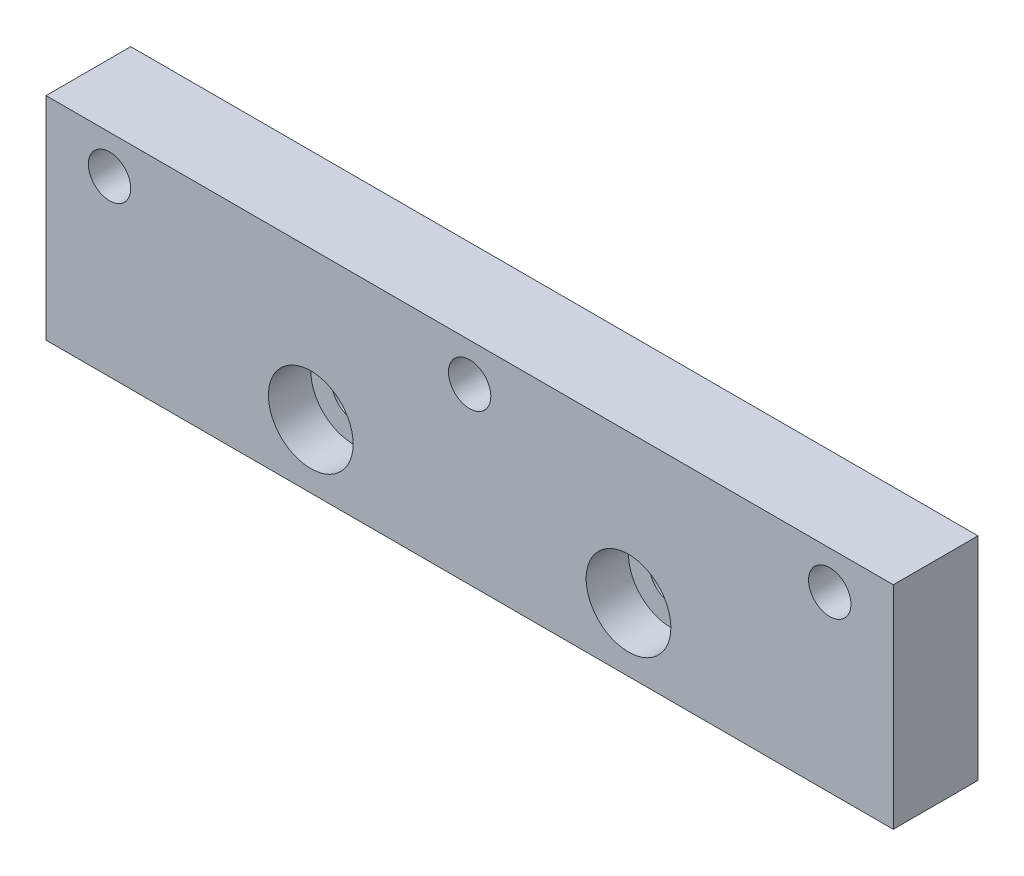
ISO-10303-21;
HEADER;
FILE_DESCRIPTION(('STEP AP214'),'2;1');
FILE_NAME('part.step','',(''),(''),'','','');
FILE_SCHEMA(('AUTOMOTIVE_DESIGN { 1 0 10303 214 1 1 1 1 }'));
ENDSEC;
DATA;
#1=APPLICATION_CONTEXT('core data for automotive mechanical design processes');
#2=APPLICATION_PROTOCOL_DEFINITION('international standard','automotive_design',2000,#1);
#3=PRODUCT_CONTEXT('',#1,'mechanical');
#4=PRODUCT('Part','Part','',(#3));
#5=PRODUCT_RELATED_PRODUCT_CATEGORY('part','',(#4));
#6=PRODUCT_DEFINITION_FORMATION('','',#4);
#7=PRODUCT_DEFINITION_CONTEXT('part definition',#1,'design');
#8=PRODUCT_DEFINITION('design','',#6,#7);
#9=PRODUCT_DEFINITION_SHAPE('','',#8);
#10=(LENGTH_UNIT() NAMED_UNIT(*) SI_UNIT(.MILLI.,.METRE.));
#11=(NAMED_UNIT(*) PLANE_ANGLE_UNIT() SI_UNIT($,.RADIAN.));
#12=(NAMED_UNIT(*) SI_UNIT($,.STERADIAN.) SOLID_ANGLE_UNIT());
#13=UNCERTAINTY_MEASURE_WITH_UNIT(LENGTH_MEASURE(1.E-05),#10,'distance_accuracy_value','');
#14=(GEOMETRIC_REPRESENTATION_CONTEXT(3) GLOBAL_UNCERTAINTY_ASSIGNED_CONTEXT((#13)) GLOBAL_UNIT_ASSIGNED_CONTEXT((#10,
#11,#12)) REPRESENTATION_CONTEXT('',''));
#15=CARTESIAN_POINT('',(0.,0.,0.));
#16=DIRECTION('',(0.,0.,1.));
#17=DIRECTION('',(1.,0.,0.));
#18=AXIS2_PLACEMENT_3D('',#15,#16,#17);
#19=CARTESIAN_POINT('',(-7.5,-2.,0.));
#20=DIRECTION('',(0.,0.,1.));
#21=DIRECTION('',(1.,0.,0.));
#22=AXIS2_PLACEMENT_3D('',#19,#20,#21);
#23=CYLINDRICAL_SURFACE('',#22,1.);
#24=CARTESIAN_POINT('',(-7.5,-2.,0.));
#25=DIRECTION('',(0.,0.,1.));
#26=DIRECTION('',(1.,0.,0.));
#27=AXIS2_PLACEMENT_3D('',#24,#25,#26);
#28=CIRCLE('',#27,1.);
#29=CARTESIAN_POINT('',(-6.5,-2.,0.));
#30=VERTEX_POINT('',#29);
#31=EDGE_CURVE('E119',#30,#30,#28,.T.);
#32=ORIENTED_EDGE('',*,*,#31,.F.);
#33=EDGE_LOOP('',(#32));
#34=FACE_BOUND('',#33,.T.);
#35=CARTESIAN_POINT('',(-7.5,-2.,2.));
#36=DIRECTION('',(0.,0.,1.));
#37=DIRECTION('',(1.,0.,0.));
#38=AXIS2_PLACEMENT_3D('',#35,#36,#37);
#39=CIRCLE('',#38,1.);
#40=CARTESIAN_POINT('',(-6.5,-2.,2.));
#41=VERTEX_POINT('',#40);
#42=EDGE_CURVE('E42',#41,#41,#39,.F.);
#43=ORIENTED_EDGE('',*,*,#42,.F.);
#44=EDGE_LOOP('',(#43));
#45=FACE_BOUND('',#44,.T.);
#46=ADVANCED_FACE('F38',(#34,#45),#23,.F.);
#47=CARTESIAN_POINT('',(7.5,-2.,0.));
#48=DIRECTION('',(0.,0.,1.));
#49=DIRECTION('',(1.,0.,0.));
#50=AXIS2_PLACEMENT_3D('',#47,#48,#49);
#51=CYLINDRICAL_SURFACE('',#50,1.);
#52=CARTESIAN_POINT('',(7.5,-2.,0.));
#53=DIRECTION('',(0.,0.,1.));
#54=DIRECTION('',(1.,0.,0.));
#55=AXIS2_PLACEMENT_3D('',#52,#53,#54);
#56=CIRCLE('',#55,1.);
#57=CARTESIAN_POINT('',(8.5,-2.,0.));
#58=VERTEX_POINT('',#57);
#59=EDGE_CURVE('E151',#58,#58,#56,.T.);
#60=ORIENTED_EDGE('',*,*,#59,.F.);
#61=EDGE_LOOP('',(#60));
#62=FACE_BOUND('',#61,.T.);
#63=CARTESIAN_POINT('',(7.5,-2.,2.));
#64=DIRECTION('',(0.,0.,1.));
#65=DIRECTION('',(1.,0.,0.));
#66=AXIS2_PLACEMENT_3D('',#63,#64,#65);
#67=CIRCLE('',#66,1.);
#68=CARTESIAN_POINT('',(8.5,-2.,2.));
#69=VERTEX_POINT('',#68);
#70=EDGE_CURVE('E113',#69,#69,#67,.F.);
#71=ORIENTED_EDGE('',*,*,#70,.F.);
#72=EDGE_LOOP('',(#71));
#73=FACE_BOUND('',#72,.T.);
#74=ADVANCED_FACE('F162',(#62,#73),#51,.F.);
#75=CARTESIAN_POINT('',(20.,5.,4.));
#76=DIRECTION('',(-1.,0.,0.));
#77=DIRECTION('',(0.,0.,1.));
#78=AXIS2_PLACEMENT_3D('',#75,#76,#77);
#79=PLANE('',#78);
#80=DIRECTION('',(0.,1.,0.));
#81=VECTOR('',#80,1.);
#82=CARTESIAN_POINT('',(20.,5.,0.));
#83=LINE('',#82,#81);
#84=CARTESIAN_POINT('',(20.,-5.,0.));
#85=VERTEX_POINT('',#84);
#86=CARTESIAN_POINT('',(20.,5.,0.));
#87=VERTEX_POINT('',#86);
#88=EDGE_CURVE('E105',#85,#87,#83,.T.);
#89=ORIENTED_EDGE('',*,*,#88,.T.);
#90=DIRECTION('',(0.,0.,-1.));
#91=VECTOR('',#90,1.);
#92=CARTESIAN_POINT('',(20.,5.,4.));
#93=LINE('',#92,#91);
#94=CARTESIAN_POINT('',(20.,5.,4.));
#95=VERTEX_POINT('',#94);
#96=EDGE_CURVE('E11',#95,#87,#93,.T.);
#97=ORIENTED_EDGE('',*,*,#96,.F.);
#98=DIRECTION('',(0.,1.,0.));
#99=VECTOR('',#98,1.);
#100=CARTESIAN_POINT('',(20.,5.,4.));
#101=LINE('',#100,#99);
#102=CARTESIAN_POINT('',(20.,-5.,4.));
#103=VERTEX_POINT('',#102);
#104=EDGE_CURVE('E92',#103,#95,#101,.T.);
#105=ORIENTED_EDGE('',*,*,#104,.F.);
#106=DIRECTION('',(0.,0.,-1.));
#107=VECTOR('',#106,1.);
#108=CARTESIAN_POINT('',(20.,-5.,4.));
#109=LINE('',#108,#107);
#110=EDGE_CURVE('E101',#103,#85,#109,.T.);
#111=ORIENTED_EDGE('',*,*,#110,.T.);
#112=EDGE_LOOP('',(#89,#97,#105,#111));
#113=FACE_BOUND('',#112,.T.);
#114=ADVANCED_FACE('F40',(#113),#79,.F.);
#115=CARTESIAN_POINT('',(-20.,5.,4.));
#116=DIRECTION('',(0.,-1.,0.));
#117=DIRECTION('',(0.,0.,-1.));
#118=AXIS2_PLACEMENT_3D('',#115,#116,#117);
#119=PLANE('',#118);
#120=DIRECTION('',(-1.,0.,0.));
#121=VECTOR('',#120,1.);
#122=CARTESIAN_POINT('',(-20.,5.,0.));
#123=LINE('',#122,#121);
#124=CARTESIAN_POINT('',(-20.,5.,0.));
#125=VERTEX_POINT('',#124);
#126=EDGE_CURVE('E96',#87,#125,#123,.T.);
#127=ORIENTED_EDGE('',*,*,#126,.T.);
#128=DIRECTION('',(0.,0.,-1.));
#129=VECTOR('',#128,1.);
#130=CARTESIAN_POINT('',(-20.,5.,4.));
#131=LINE('',#130,#129);
#132=CARTESIAN_POINT('',(-20.,5.,4.));
#133=VERTEX_POINT('',#132);
#134=EDGE_CURVE('E48',#133,#125,#131,.T.);
#135=ORIENTED_EDGE('',*,*,#134,.F.);
#136=DIRECTION('',(-1.,0.,0.));
#137=VECTOR('',#136,1.);
#138=CARTESIAN_POINT('',(-20.,5.,4.));
#139=LINE('',#138,#137);
#140=EDGE_CURVE('E87',#95,#133,#139,.T.);
#141=ORIENTED_EDGE('',*,*,#140,.F.);
#142=ORIENTED_EDGE('',*,*,#96,.T.);
#143=EDGE_LOOP('',(#127,#135,#141,#142));
#144=FACE_BOUND('',#143,.T.);
#145=ADVANCED_FACE('F95',(#144),#119,.F.);
#146=CARTESIAN_POINT('',(-20.,5.,4.));
#147=DIRECTION('',(1.,0.,0.));
#148=DIRECTION('',(0.,0.,-1.));
#149=AXIS2_PLACEMENT_3D('',#146,#147,#148);
#150=PLANE('',#149);
#151=DIRECTION('',(0.,-1.,0.));
#152=VECTOR('',#151,1.);
#153=CARTESIAN_POINT('',(-20.,5.,0.));
#154=LINE('',#153,#152);
#155=CARTESIAN_POINT('',(-20.,-5.,0.));
#156=VERTEX_POINT('',#155);
#157=EDGE_CURVE('E74',#125,#156,#154,.T.);
#158=ORIENTED_EDGE('',*,*,#157,.T.);
#159=DIRECTION('',(0.,0.,-1.));
#160=VECTOR('',#159,1.);
#161=CARTESIAN_POINT('',(-20.,-5.,4.));
#162=LINE('',#161,#160);
#163=CARTESIAN_POINT('',(-20.,-5.,4.));
#164=VERTEX_POINT('',#163);
#165=EDGE_CURVE('E97',#164,#156,#162,.T.);
#166=ORIENTED_EDGE('',*,*,#165,.F.);
#167=DIRECTION('',(0.,-1.,0.));
#168=VECTOR('',#167,1.);
#169=CARTESIAN_POINT('',(-20.,5.,4.));
#170=LINE('',#169,#168);
#171=EDGE_CURVE('E90',#133,#164,#170,.T.);
#172=ORIENTED_EDGE('',*,*,#171,.F.);
#173=ORIENTED_EDGE('',*,*,#134,.T.);
#174=EDGE_LOOP('',(#158,#166,#172,#173));
#175=FACE_BOUND('',#174,.T.);
#176=ADVANCED_FACE('F99',(#175),#150,.F.);
#177=CARTESIAN_POINT('',(-20.,-5.,4.));
#178=DIRECTION('',(0.,1.,0.));
#179=DIRECTION('',(0.,0.,1.));
#180=AXIS2_PLACEMENT_3D('',#177,#178,#179);
#181=PLANE('',#180);
#182=DIRECTION('',(1.,0.,0.));
#183=VECTOR('',#182,1.);
#184=CARTESIAN_POINT('',(-20.,-5.,0.));
#185=LINE('',#184,#183);
#186=EDGE_CURVE('E80',#156,#85,#185,.T.);
#187=ORIENTED_EDGE('',*,*,#186,.T.);
#188=ORIENTED_EDGE('',*,*,#110,.F.);
#189=DIRECTION('',(1.,0.,0.));
#190=VECTOR('',#189,1.);
#191=CARTESIAN_POINT('',(-20.,-5.,4.));
#192=LINE('',#191,#190);
#193=EDGE_CURVE('E57',#164,#103,#192,.T.);
#194=ORIENTED_EDGE('',*,*,#193,.F.);
#195=ORIENTED_EDGE('',*,*,#165,.T.);
#196=EDGE_LOOP('',(#187,#188,#194,#195));
#197=FACE_BOUND('',#196,.T.);
#198=ADVANCED_FACE('F201',(#197),#181,.F.);
#199=CARTESIAN_POINT('',(0.,0.,4.));
#200=DIRECTION('',(0.,0.,1.));
#201=DIRECTION('',(1.,0.,0.));
#202=AXIS2_PLACEMENT_3D('',#199,#200,#201);
#203=PLANE('',#202);
#204=CARTESIAN_POINT('',(-7.5,-2.,4.));
#205=DIRECTION('',(0.,0.,1.));
#206=DIRECTION('',(1.,0.,0.));
#207=AXIS2_PLACEMENT_3D('',#204,#205,#206);
#208=CIRCLE('',#207,2.);
#209=CARTESIAN_POINT('',(-5.5,-2.,4.));
#210=VERTEX_POINT('',#209);
#211=EDGE_CURVE('E121',#210,#210,#208,.T.);
#212=ORIENTED_EDGE('',*,*,#211,.F.);
#213=EDGE_LOOP('',(#212));
#214=FACE_BOUND('',#213,.T.);
#215=CARTESIAN_POINT('',(7.5,-2.,4.));
#216=DIRECTION('',(0.,0.,1.));
#217=DIRECTION('',(1.,0.,0.));
#218=AXIS2_PLACEMENT_3D('',#215,#216,#217);
#219=CIRCLE('',#218,2.);
#220=CARTESIAN_POINT('',(9.5,-2.,4.));
#221=VERTEX_POINT('',#220);
#222=EDGE_CURVE('E126',#221,#221,#219,.T.);
#223=ORIENTED_EDGE('',*,*,#222,.F.);
#224=EDGE_LOOP('',(#223));
#225=FACE_BOUND('',#224,.T.);
#226=CARTESIAN_POINT('',(-16.9999999999991,3.20000000000005,4.));
#227=DIRECTION('',(0.,0.,1.));
#228=DIRECTION('',(1.,0.,0.));
#229=AXIS2_PLACEMENT_3D('',#226,#227,#228);
#230=CIRCLE('',#229,1.);
#231=CARTESIAN_POINT('',(-15.9999999999991,3.20000000000005,4.));
#232=VERTEX_POINT('',#231);
#233=EDGE_CURVE('E136',#232,#232,#230,.T.);
#234=ORIENTED_EDGE('',*,*,#233,.F.);
#235=EDGE_LOOP('',(#234));
#236=FACE_BOUND('',#235,.T.);
#237=CARTESIAN_POINT('',(8.98586760555986E-13,3.20000000000005,4.));
#238=DIRECTION('',(0.,0.,1.));
#239=DIRECTION('',(1.,0.,0.));
#240=AXIS2_PLACEMENT_3D('',#237,#238,#239);
#241=CIRCLE('',#240,1.);
#242=CARTESIAN_POINT('',(1.0000000000009,3.20000000000005,4.));
#243=VERTEX_POINT('',#242);
#244=EDGE_CURVE('E139',#243,#243,#241,.T.);
#245=ORIENTED_EDGE('',*,*,#244,.F.);
#246=EDGE_LOOP('',(#245));
#247=FACE_BOUND('',#246,.T.);
#248=CARTESIAN_POINT('',(17.0000000000009,3.20000000000005,4.));
#249=DIRECTION('',(0.,0.,1.));
#250=DIRECTION('',(1.,0.,0.));
#251=AXIS2_PLACEMENT_3D('',#248,#249,#250);
#252=CIRCLE('',#251,1.);
#253=CARTESIAN_POINT('',(18.0000000000009,3.20000000000005,4.));
#254=VERTEX_POINT('',#253);
#255=EDGE_CURVE('E145',#254,#254,#252,.T.);
#256=ORIENTED_EDGE('',*,*,#255,.F.);
#257=EDGE_LOOP('',(#256));
#258=FACE_BOUND('',#257,.T.);
#259=ORIENTED_EDGE('',*,*,#104,.T.);
#260=ORIENTED_EDGE('',*,*,#140,.T.);
#261=ORIENTED_EDGE('',*,*,#171,.T.);
#262=ORIENTED_EDGE('',*,*,#193,.T.);
#263=EDGE_LOOP('',(#259,#260,#261,#262));
#264=FACE_BOUND('',#263,.T.);
#265=ADVANCED_FACE('F88',(#214,#225,#236,#247,#258,#264),#203,.T.);
#266=CARTESIAN_POINT('',(0.,0.,0.));
#267=DIRECTION('',(0.,0.,1.));
#268=DIRECTION('',(1.,0.,0.));
#269=AXIS2_PLACEMENT_3D('',#266,#267,#268);
#270=PLANE('',#269);
#271=CARTESIAN_POINT('',(-16.9999999999991,3.20000000000005,0.));
#272=DIRECTION('',(0.,0.,1.));
#273=DIRECTION('',(1.,0.,0.));
#274=AXIS2_PLACEMENT_3D('',#271,#272,#273);
#275=CIRCLE('',#274,1.);
#276=CARTESIAN_POINT('',(-15.9999999999991,3.20000000000005,0.));
#277=VERTEX_POINT('',#276);
#278=EDGE_CURVE('E108',#277,#277,#275,.T.);
#279=ORIENTED_EDGE('',*,*,#278,.T.);
#280=EDGE_LOOP('',(#279));
#281=FACE_BOUND('',#280,.T.);
#282=CARTESIAN_POINT('',(8.98586760555986E-13,3.20000000000005,0.));
#283=DIRECTION('',(0.,0.,1.));
#284=DIRECTION('',(1.,0.,0.));
#285=AXIS2_PLACEMENT_3D('',#282,#283,#284);
#286=CIRCLE('',#285,1.);
#287=CARTESIAN_POINT('',(1.0000000000009,3.20000000000005,0.));
#288=VERTEX_POINT('',#287);
#289=EDGE_CURVE('E142',#288,#288,#286,.T.);
#290=ORIENTED_EDGE('',*,*,#289,.T.);
#291=EDGE_LOOP('',(#290));
#292=FACE_BOUND('',#291,.T.);
#293=CARTESIAN_POINT('',(17.0000000000009,3.20000000000005,0.));
#294=DIRECTION('',(0.,0.,1.));
#295=DIRECTION('',(1.,0.,0.));
#296=AXIS2_PLACEMENT_3D('',#293,#294,#295);
#297=CIRCLE('',#296,1.);
#298=CARTESIAN_POINT('',(18.0000000000009,3.20000000000005,0.));
#299=VERTEX_POINT('',#298);
#300=EDGE_CURVE('E148',#299,#299,#297,.T.);
#301=ORIENTED_EDGE('',*,*,#300,.T.);
#302=EDGE_LOOP('',(#301));
#303=FACE_BOUND('',#302,.T.);
#304=ORIENTED_EDGE('',*,*,#59,.T.);
#305=EDGE_LOOP('',(#304));
#306=FACE_BOUND('',#305,.T.);
#307=ORIENTED_EDGE('',*,*,#31,.T.);
#308=EDGE_LOOP('',(#307));
#309=FACE_BOUND('',#308,.T.);
#310=ORIENTED_EDGE('',*,*,#88,.F.);
#311=ORIENTED_EDGE('',*,*,#186,.F.);
#312=ORIENTED_EDGE('',*,*,#157,.F.);
#313=ORIENTED_EDGE('',*,*,#126,.F.);
#314=EDGE_LOOP('',(#310,#311,#312,#313));
#315=FACE_BOUND('',#314,.T.);
#316=ADVANCED_FACE('F157',(#281,#292,#303,#306,#309,#315),#270,.F.);
#317=CARTESIAN_POINT('',(17.0000000000009,3.20000000000005,0.));
#318=DIRECTION('',(0.,0.,1.));
#319=DIRECTION('',(1.,0.,0.));
#320=AXIS2_PLACEMENT_3D('',#317,#318,#319);
#321=CYLINDRICAL_SURFACE('',#320,1.);
#322=ORIENTED_EDGE('',*,*,#300,.F.);
#323=EDGE_LOOP('',(#322));
#324=FACE_BOUND('',#323,.T.);
#325=ORIENTED_EDGE('',*,*,#255,.T.);
#326=EDGE_LOOP('',(#325));
#327=FACE_BOUND('',#326,.T.);
#328=ADVANCED_FACE('F191',(#324,#327),#321,.F.);
#329=CARTESIAN_POINT('',(8.98586760555986E-13,3.20000000000005,0.));
#330=DIRECTION('',(0.,0.,1.));
#331=DIRECTION('',(1.,0.,0.));
#332=AXIS2_PLACEMENT_3D('',#329,#330,#331);
#333=CYLINDRICAL_SURFACE('',#332,1.);
#334=ORIENTED_EDGE('',*,*,#289,.F.);
#335=EDGE_LOOP('',(#334));
#336=FACE_BOUND('',#335,.T.);
#337=ORIENTED_EDGE('',*,*,#244,.T.);
#338=EDGE_LOOP('',(#337));
#339=FACE_BOUND('',#338,.T.);
#340=ADVANCED_FACE('F187',(#336,#339),#333,.F.);
#341=CARTESIAN_POINT('',(-16.9999999999991,3.20000000000005,0.));
#342=DIRECTION('',(0.,0.,1.));
#343=DIRECTION('',(1.,0.,0.));
#344=AXIS2_PLACEMENT_3D('',#341,#342,#343);
#345=CYLINDRICAL_SURFACE('',#344,1.);
#346=ORIENTED_EDGE('',*,*,#278,.F.);
#347=EDGE_LOOP('',(#346));
#348=FACE_BOUND('',#347,.T.);
#349=ORIENTED_EDGE('',*,*,#233,.T.);
#350=EDGE_LOOP('',(#349));
#351=FACE_BOUND('',#350,.T.);
#352=ADVANCED_FACE('F183',(#348,#351),#345,.F.);
#353=CARTESIAN_POINT('',(7.5,-2.,2.));
#354=DIRECTION('',(0.,0.,1.));
#355=DIRECTION('',(1.,0.,0.));
#356=AXIS2_PLACEMENT_3D('',#353,#354,#355);
#357=PLANE('',#356);
#358=CARTESIAN_POINT('',(7.5,-2.,2.));
#359=DIRECTION('',(0.,0.,1.));
#360=DIRECTION('',(1.,0.,0.));
#361=AXIS2_PLACEMENT_3D('',#358,#359,#360);
#362=CIRCLE('',#361,2.);
#363=CARTESIAN_POINT('',(9.5,-2.,2.));
#364=VERTEX_POINT('',#363);
#365=EDGE_CURVE('E131',#364,#364,#362,.T.);
#366=ORIENTED_EDGE('',*,*,#365,.T.);
#367=EDGE_LOOP('',(#366));
#368=FACE_BOUND('',#367,.T.);
#369=ORIENTED_EDGE('',*,*,#70,.T.);
#370=EDGE_LOOP('',(#369));
#371=FACE_BOUND('',#370,.T.);
#372=ADVANCED_FACE('F177',(#368,#371),#357,.T.);
#373=CARTESIAN_POINT('',(7.5,-2.,2.));
#374=DIRECTION('',(0.,0.,1.));
#375=DIRECTION('',(1.,0.,0.));
#376=AXIS2_PLACEMENT_3D('',#373,#374,#375);
#377=CYLINDRICAL_SURFACE('',#376,2.);
#378=ORIENTED_EDGE('',*,*,#365,.F.);
#379=EDGE_LOOP('',(#378));
#380=FACE_BOUND('',#379,.T.);
#381=ORIENTED_EDGE('',*,*,#222,.T.);
#382=EDGE_LOOP('',(#381));
#383=FACE_BOUND('',#382,.T.);
#384=ADVANCED_FACE('F169',(#380,#383),#377,.F.);
#385=CARTESIAN_POINT('',(-7.5,-2.,2.));
#386=DIRECTION('',(0.,0.,1.));
#387=DIRECTION('',(1.,0.,0.));
#388=AXIS2_PLACEMENT_3D('',#385,#386,#387);
#389=PLANE('',#388);
#390=CARTESIAN_POINT('',(-7.5,-2.,2.));
#391=DIRECTION('',(0.,0.,1.));
#392=DIRECTION('',(1.,0.,0.));
#393=AXIS2_PLACEMENT_3D('',#390,#391,#392);
#394=CIRCLE('',#393,2.);
#395=CARTESIAN_POINT('',(-5.5,-2.,2.));
#396=VERTEX_POINT('',#395);
#397=EDGE_CURVE('E115',#396,#396,#394,.T.);
#398=ORIENTED_EDGE('',*,*,#397,.T.);
#399=EDGE_LOOP('',(#398));
#400=FACE_BOUND('',#399,.T.);
#401=ORIENTED_EDGE('',*,*,#42,.T.);
#402=EDGE_LOOP('',(#401));
#403=FACE_BOUND('',#402,.T.);
#404=ADVANCED_FACE('F166',(#400,#403),#389,.T.);
#405=CARTESIAN_POINT('',(-7.5,-2.,2.));
#406=DIRECTION('',(0.,0.,1.));
#407=DIRECTION('',(1.,0.,0.));
#408=AXIS2_PLACEMENT_3D('',#405,#406,#407);
#409=CYLINDRICAL_SURFACE('',#408,2.);
#410=ORIENTED_EDGE('',*,*,#397,.F.);
#411=EDGE_LOOP('',(#410));
#412=FACE_BOUND('',#411,.T.);
#413=ORIENTED_EDGE('',*,*,#211,.T.);
#414=EDGE_LOOP('',(#413));
#415=FACE_BOUND('',#414,.T.);
#416=ADVANCED_FACE('F168',(#412,#415),#409,.F.);
#417=CLOSED_SHELL('',(#46,#74,#114,#145,#176,#198,#265,#316,#328,#340,#352,#372,#384,#404,#416));
#418=MANIFOLD_SOLID_BREP('B2',#417);
#419=ADVANCED_BREP_SHAPE_REPRESENTATION('',(#18,#418),#14);
#420=SHAPE_DEFINITION_REPRESENTATION(#9,#419);
ENDSEC;
END-ISO-10303-21;
